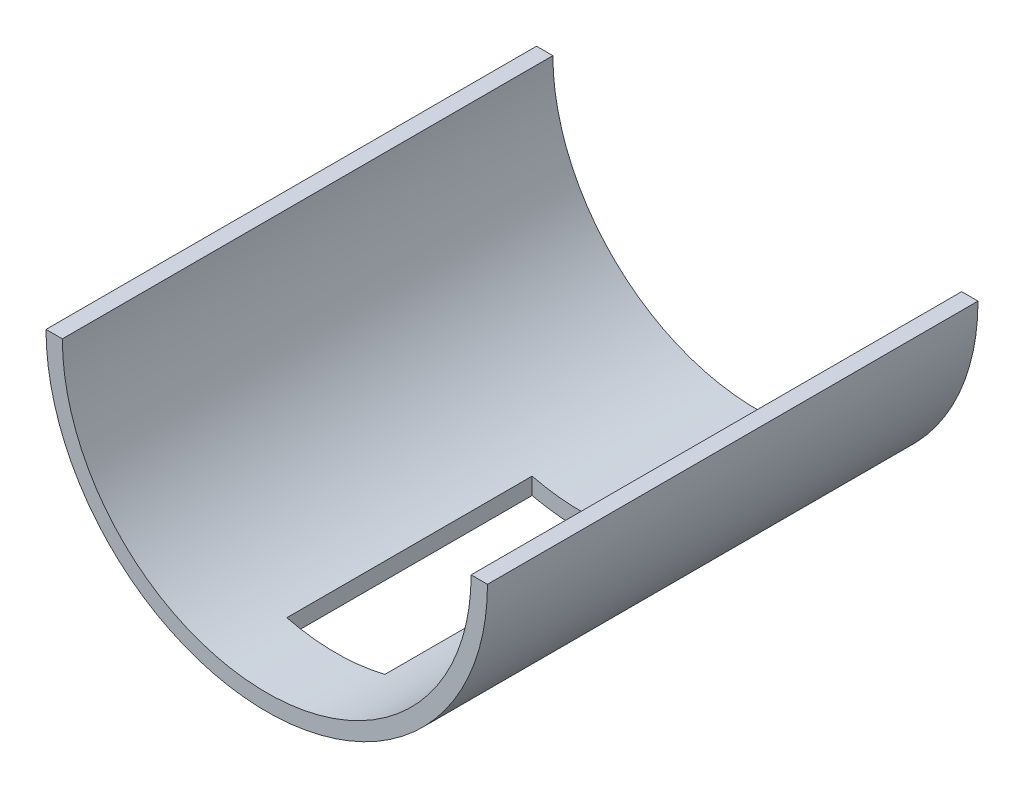
ISO-10303-21;
HEADER;
FILE_DESCRIPTION(('STEP AP214'),'2;1');
FILE_NAME('part.step','',(''),(''),'','','');
FILE_SCHEMA(('AUTOMOTIVE_DESIGN { 1 0 10303 214 1 1 1 1 }'));
ENDSEC;
DATA;
#1=APPLICATION_CONTEXT('core data for automotive mechanical design processes');
#2=APPLICATION_PROTOCOL_DEFINITION('international standard','automotive_design',2000,#1);
#3=PRODUCT_CONTEXT('',#1,'mechanical');
#4=PRODUCT('Part','Part','',(#3));
#5=PRODUCT_RELATED_PRODUCT_CATEGORY('part','',(#4));
#6=PRODUCT_DEFINITION_FORMATION('','',#4);
#7=PRODUCT_DEFINITION_CONTEXT('part definition',#1,'design');
#8=PRODUCT_DEFINITION('design','',#6,#7);
#9=PRODUCT_DEFINITION_SHAPE('','',#8);
#10=(LENGTH_UNIT() NAMED_UNIT(*) SI_UNIT(.MILLI.,.METRE.));
#11=(NAMED_UNIT(*) PLANE_ANGLE_UNIT() SI_UNIT($,.RADIAN.));
#12=(NAMED_UNIT(*) SI_UNIT($,.STERADIAN.) SOLID_ANGLE_UNIT());
#13=UNCERTAINTY_MEASURE_WITH_UNIT(LENGTH_MEASURE(1.E-05),#10,'distance_accuracy_value','');
#14=(GEOMETRIC_REPRESENTATION_CONTEXT(3) GLOBAL_UNCERTAINTY_ASSIGNED_CONTEXT((#13)) GLOBAL_UNIT_ASSIGNED_CONTEXT((#10,
#11,#12)) REPRESENTATION_CONTEXT('',''));
#15=CARTESIAN_POINT('',(0.,0.,0.));
#16=DIRECTION('',(0.,0.,1.));
#17=DIRECTION('',(1.,0.,0.));
#18=AXIS2_PLACEMENT_3D('',#15,#16,#17);
#19=CARTESIAN_POINT('',(0.,0.,60.));
#20=DIRECTION('',(0.,0.,-1.));
#21=DIRECTION('',(-1.,0.,0.));
#22=AXIS2_PLACEMENT_3D('',#19,#20,#21);
#23=CYLINDRICAL_SURFACE('',#22,27.);
#24=DIRECTION('',(0.,0.,-1.));
#25=VECTOR('',#24,1.);
#26=CARTESIAN_POINT('',(6.00000000000001,-26.3248931621764,60.));
#27=LINE('',#26,#25);
#28=CARTESIAN_POINT('',(6.00000000000001,-26.3248931621764,51.5449540452696));
#29=VERTEX_POINT('',#28);
#30=CARTESIAN_POINT('',(6.,-26.3248931621764,21.5449540452696));
#31=VERTEX_POINT('',#30);
#32=EDGE_CURVE('E106',#29,#31,#27,.T.);
#33=ORIENTED_EDGE('',*,*,#32,.T.);
#34=CARTESIAN_POINT('',(0.,0.,21.5449540452696));
#35=DIRECTION('',(0.,0.,-1.));
#36=DIRECTION('',(-1.,0.,0.));
#37=AXIS2_PLACEMENT_3D('',#34,#35,#36);
#38=CIRCLE('',#37,27.);
#39=CARTESIAN_POINT('',(-6.,-26.3248931621764,21.5449540452696));
#40=VERTEX_POINT('',#39);
#41=EDGE_CURVE('E47',#31,#40,#38,.T.);
#42=ORIENTED_EDGE('',*,*,#41,.T.);
#43=DIRECTION('',(0.,0.,-1.));
#44=VECTOR('',#43,1.);
#45=CARTESIAN_POINT('',(-5.99999999999999,-26.3248931621764,60.));
#46=LINE('',#45,#44);
#47=CARTESIAN_POINT('',(-5.99999999999999,-26.3248931621764,51.5449540452696));
#48=VERTEX_POINT('',#47);
#49=EDGE_CURVE('E99',#40,#48,#46,.F.);
#50=ORIENTED_EDGE('',*,*,#49,.T.);
#51=CARTESIAN_POINT('',(0.,0.,51.5449540452696));
#52=DIRECTION('',(0.,0.,1.));
#53=DIRECTION('',(1.,0.,0.));
#54=AXIS2_PLACEMENT_3D('',#51,#52,#53);
#55=CIRCLE('',#54,27.);
#56=EDGE_CURVE('E111',#48,#29,#55,.T.);
#57=ORIENTED_EDGE('',*,*,#56,.T.);
#58=EDGE_LOOP('',(#33,#42,#50,#57));
#59=FACE_BOUND('',#58,.T.);
#60=CARTESIAN_POINT('',(0.,0.,0.));
#61=DIRECTION('',(0.,0.,1.));
#62=DIRECTION('',(-1.,0.,0.));
#63=AXIS2_PLACEMENT_3D('',#60,#61,#62);
#64=CIRCLE('',#63,27.);
#65=CARTESIAN_POINT('',(-27.,0.,0.));
#66=VERTEX_POINT('',#65);
#67=CARTESIAN_POINT('',(27.,0.,0.));
#68=VERTEX_POINT('',#67);
#69=EDGE_CURVE('E112',#66,#68,#64,.T.);
#70=ORIENTED_EDGE('',*,*,#69,.T.);
#71=DIRECTION('',(0.,0.,-1.));
#72=VECTOR('',#71,1.);
#73=CARTESIAN_POINT('',(27.,0.,60.));
#74=LINE('',#73,#72);
#75=CARTESIAN_POINT('',(27.,0.,60.));
#76=VERTEX_POINT('',#75);
#77=EDGE_CURVE('E143',#76,#68,#74,.T.);
#78=ORIENTED_EDGE('',*,*,#77,.F.);
#79=CARTESIAN_POINT('',(0.,0.,60.));
#80=DIRECTION('',(0.,0.,1.));
#81=DIRECTION('',(-1.,0.,0.));
#82=AXIS2_PLACEMENT_3D('',#79,#80,#81);
#83=CIRCLE('',#82,27.);
#84=CARTESIAN_POINT('',(-27.,0.,60.));
#85=VERTEX_POINT('',#84);
#86=EDGE_CURVE('E120',#85,#76,#83,.T.);
#87=ORIENTED_EDGE('',*,*,#86,.F.);
#88=DIRECTION('',(0.,0.,-1.));
#89=VECTOR('',#88,1.);
#90=CARTESIAN_POINT('',(-27.,0.,60.));
#91=LINE('',#90,#89);
#92=EDGE_CURVE('E129',#85,#66,#91,.T.);
#93=ORIENTED_EDGE('',*,*,#92,.T.);
#94=EDGE_LOOP('',(#70,#78,#87,#93));
#95=FACE_BOUND('',#94,.T.);
#96=ADVANCED_FACE('F33',(#59,#95),#23,.T.);
#97=CARTESIAN_POINT('',(25.,0.,60.));
#98=DIRECTION('',(0.,-1.,0.));
#99=DIRECTION('',(0.,0.,-1.));
#100=AXIS2_PLACEMENT_3D('',#97,#98,#99);
#101=PLANE('',#100);
#102=DIRECTION('',(-1.,0.,0.));
#103=VECTOR('',#102,1.);
#104=CARTESIAN_POINT('',(25.,0.,0.));
#105=LINE('',#104,#103);
#106=CARTESIAN_POINT('',(25.,0.,0.));
#107=VERTEX_POINT('',#106);
#108=EDGE_CURVE('E115',#68,#107,#105,.T.);
#109=ORIENTED_EDGE('',*,*,#108,.T.);
#110=DIRECTION('',(0.,0.,-1.));
#111=VECTOR('',#110,1.);
#112=CARTESIAN_POINT('',(25.,0.,60.));
#113=LINE('',#112,#111);
#114=CARTESIAN_POINT('',(25.,0.,60.));
#115=VERTEX_POINT('',#114);
#116=EDGE_CURVE('E140',#115,#107,#113,.T.);
#117=ORIENTED_EDGE('',*,*,#116,.F.);
#118=DIRECTION('',(-1.,0.,0.));
#119=VECTOR('',#118,1.);
#120=CARTESIAN_POINT('',(25.,0.,60.));
#121=LINE('',#120,#119);
#122=EDGE_CURVE('E123',#76,#115,#121,.T.);
#123=ORIENTED_EDGE('',*,*,#122,.F.);
#124=ORIENTED_EDGE('',*,*,#77,.T.);
#125=EDGE_LOOP('',(#109,#117,#123,#124));
#126=FACE_BOUND('',#125,.T.);
#127=ADVANCED_FACE('F173',(#126),#101,.F.);
#128=CARTESIAN_POINT('',(0.,0.,60.));
#129=DIRECTION('',(0.,0.,-1.));
#130=DIRECTION('',(-1.,0.,0.));
#131=AXIS2_PLACEMENT_3D('',#128,#129,#130);
#132=CYLINDRICAL_SURFACE('',#131,25.);
#133=CARTESIAN_POINT('',(0.,0.,21.5449540452696));
#134=DIRECTION('',(0.,0.,-1.));
#135=DIRECTION('',(-1.,0.,0.));
#136=AXIS2_PLACEMENT_3D('',#133,#134,#135);
#137=CIRCLE('',#136,25.);
#138=CARTESIAN_POINT('',(-6.,-24.2693221990232,21.5449540452696));
#139=VERTEX_POINT('',#138);
#140=CARTESIAN_POINT('',(6.,-24.2693221990232,21.5449540452696));
#141=VERTEX_POINT('',#140);
#142=EDGE_CURVE('E146',#139,#141,#137,.F.);
#143=ORIENTED_EDGE('',*,*,#142,.T.);
#144=DIRECTION('',(0.,0.,-1.));
#145=VECTOR('',#144,1.);
#146=CARTESIAN_POINT('',(6.00000000000001,-24.2693221990232,60.));
#147=LINE('',#146,#145);
#148=CARTESIAN_POINT('',(6.00000000000001,-24.2693221990232,51.5449540452696));
#149=VERTEX_POINT('',#148);
#150=EDGE_CURVE('E11',#141,#149,#147,.F.);
#151=ORIENTED_EDGE('',*,*,#150,.T.);
#152=CARTESIAN_POINT('',(0.,0.,51.5449540452696));
#153=DIRECTION('',(0.,0.,1.));
#154=DIRECTION('',(1.,0.,0.));
#155=AXIS2_PLACEMENT_3D('',#152,#153,#154);
#156=CIRCLE('',#155,25.);
#157=CARTESIAN_POINT('',(-5.99999999999999,-24.2693221990232,51.5449540452696));
#158=VERTEX_POINT('',#157);
#159=EDGE_CURVE('E40',#149,#158,#156,.F.);
#160=ORIENTED_EDGE('',*,*,#159,.T.);
#161=DIRECTION('',(0.,0.,-1.));
#162=VECTOR('',#161,1.);
#163=CARTESIAN_POINT('',(-5.99999999999999,-24.2693221990232,60.));
#164=LINE('',#163,#162);
#165=EDGE_CURVE('E148',#158,#139,#164,.T.);
#166=ORIENTED_EDGE('',*,*,#165,.T.);
#167=EDGE_LOOP('',(#143,#151,#160,#166));
#168=FACE_BOUND('',#167,.T.);
#169=CARTESIAN_POINT('',(0.,0.,0.));
#170=DIRECTION('',(0.,0.,-1.));
#171=DIRECTION('',(-1.,0.,0.));
#172=AXIS2_PLACEMENT_3D('',#169,#170,#171);
#173=CIRCLE('',#172,25.);
#174=CARTESIAN_POINT('',(-25.,0.,0.));
#175=VERTEX_POINT('',#174);
#176=EDGE_CURVE('E132',#107,#175,#173,.T.);
#177=ORIENTED_EDGE('',*,*,#176,.T.);
#178=DIRECTION('',(0.,0.,-1.));
#179=VECTOR('',#178,1.);
#180=CARTESIAN_POINT('',(-25.,0.,60.));
#181=LINE('',#180,#179);
#182=CARTESIAN_POINT('',(-25.,0.,60.));
#183=VERTEX_POINT('',#182);
#184=EDGE_CURVE('E137',#183,#175,#181,.T.);
#185=ORIENTED_EDGE('',*,*,#184,.F.);
#186=CARTESIAN_POINT('',(0.,0.,60.));
#187=DIRECTION('',(0.,0.,-1.));
#188=DIRECTION('',(-1.,0.,0.));
#189=AXIS2_PLACEMENT_3D('',#186,#187,#188);
#190=CIRCLE('',#189,25.);
#191=EDGE_CURVE('E126',#115,#183,#190,.T.);
#192=ORIENTED_EDGE('',*,*,#191,.F.);
#193=ORIENTED_EDGE('',*,*,#116,.T.);
#194=EDGE_LOOP('',(#177,#185,#192,#193));
#195=FACE_BOUND('',#194,.T.);
#196=ADVANCED_FACE('F152',(#168,#195),#132,.F.);
#197=CARTESIAN_POINT('',(-27.,0.,60.));
#198=DIRECTION('',(0.,-1.,0.));
#199=DIRECTION('',(0.,0.,-1.));
#200=AXIS2_PLACEMENT_3D('',#197,#198,#199);
#201=PLANE('',#200);
#202=DIRECTION('',(-1.,0.,0.));
#203=VECTOR('',#202,1.);
#204=CARTESIAN_POINT('',(-27.,0.,0.));
#205=LINE('',#204,#203);
#206=EDGE_CURVE('E124',#175,#66,#205,.T.);
#207=ORIENTED_EDGE('',*,*,#206,.T.);
#208=ORIENTED_EDGE('',*,*,#92,.F.);
#209=DIRECTION('',(-1.,0.,0.));
#210=VECTOR('',#209,1.);
#211=CARTESIAN_POINT('',(-27.,0.,60.));
#212=LINE('',#211,#210);
#213=EDGE_CURVE('E128',#183,#85,#212,.T.);
#214=ORIENTED_EDGE('',*,*,#213,.F.);
#215=ORIENTED_EDGE('',*,*,#184,.T.);
#216=EDGE_LOOP('',(#207,#208,#214,#215));
#217=FACE_BOUND('',#216,.T.);
#218=ADVANCED_FACE('F181',(#217),#201,.F.);
#219=CARTESIAN_POINT('',(0.,0.,60.));
#220=DIRECTION('',(0.,0.,-1.));
#221=DIRECTION('',(-1.,0.,0.));
#222=AXIS2_PLACEMENT_3D('',#219,#220,#221);
#223=PLANE('',#222);
#224=ORIENTED_EDGE('',*,*,#86,.T.);
#225=ORIENTED_EDGE('',*,*,#122,.T.);
#226=ORIENTED_EDGE('',*,*,#191,.T.);
#227=ORIENTED_EDGE('',*,*,#213,.T.);
#228=EDGE_LOOP('',(#224,#225,#226,#227));
#229=FACE_BOUND('',#228,.T.);
#230=ADVANCED_FACE('F186',(#229),#223,.F.);
#231=CARTESIAN_POINT('',(0.,0.,0.));
#232=DIRECTION('',(0.,0.,-1.));
#233=DIRECTION('',(-1.,0.,0.));
#234=AXIS2_PLACEMENT_3D('',#231,#232,#233);
#235=PLANE('',#234);
#236=ORIENTED_EDGE('',*,*,#69,.F.);
#237=ORIENTED_EDGE('',*,*,#206,.F.);
#238=ORIENTED_EDGE('',*,*,#176,.F.);
#239=ORIENTED_EDGE('',*,*,#108,.F.);
#240=EDGE_LOOP('',(#236,#237,#238,#239));
#241=FACE_BOUND('',#240,.T.);
#242=ADVANCED_FACE('F188',(#241),#235,.T.);
#243=CARTESIAN_POINT('',(6.,-27.,21.5449540452696));
#244=DIRECTION('',(1.,0.,0.));
#245=DIRECTION('',(0.,0.,-1.));
#246=AXIS2_PLACEMENT_3D('',#243,#244,#245);
#247=PLANE('',#246);
#248=DIRECTION('',(0.,1.,0.));
#249=VECTOR('',#248,1.);
#250=CARTESIAN_POINT('',(6.00000000000001,-27.,51.5449540452696));
#251=LINE('',#250,#249);
#252=EDGE_CURVE('E100',#29,#149,#251,.T.);
#253=ORIENTED_EDGE('',*,*,#252,.T.);
#254=ORIENTED_EDGE('',*,*,#150,.F.);
#255=DIRECTION('',(0.,1.,0.));
#256=VECTOR('',#255,1.);
#257=CARTESIAN_POINT('',(6.,-27.,21.5449540452696));
#258=LINE('',#257,#256);
#259=EDGE_CURVE('E54',#31,#141,#258,.T.);
#260=ORIENTED_EDGE('',*,*,#259,.F.);
#261=ORIENTED_EDGE('',*,*,#32,.F.);
#262=EDGE_LOOP('',(#253,#254,#260,#261));
#263=FACE_BOUND('',#262,.T.);
#264=ADVANCED_FACE('F105',(#263),#247,.F.);
#265=CARTESIAN_POINT('',(-5.99999999999999,-27.,51.5449540452696));
#266=DIRECTION('',(0.,0.,1.));
#267=DIRECTION('',(1.,0.,0.));
#268=AXIS2_PLACEMENT_3D('',#265,#266,#267);
#269=PLANE('',#268);
#270=DIRECTION('',(0.,1.,0.));
#271=VECTOR('',#270,1.);
#272=CARTESIAN_POINT('',(-5.99999999999999,-27.,51.5449540452696));
#273=LINE('',#272,#271);
#274=EDGE_CURVE('E158',#48,#158,#273,.T.);
#275=ORIENTED_EDGE('',*,*,#274,.T.);
#276=ORIENTED_EDGE('',*,*,#159,.F.);
#277=ORIENTED_EDGE('',*,*,#252,.F.);
#278=ORIENTED_EDGE('',*,*,#56,.F.);
#279=EDGE_LOOP('',(#275,#276,#277,#278));
#280=FACE_BOUND('',#279,.T.);
#281=ADVANCED_FACE('F156',(#280),#269,.F.);
#282=CARTESIAN_POINT('',(-6.,-27.,21.5449540452696));
#283=DIRECTION('',(-1.,0.,0.));
#284=DIRECTION('',(0.,0.,1.));
#285=AXIS2_PLACEMENT_3D('',#282,#283,#284);
#286=PLANE('',#285);
#287=DIRECTION('',(0.,1.,0.));
#288=VECTOR('',#287,1.);
#289=CARTESIAN_POINT('',(-6.,-27.,21.5449540452696));
#290=LINE('',#289,#288);
#291=EDGE_CURVE('E97',#40,#139,#290,.T.);
#292=ORIENTED_EDGE('',*,*,#291,.T.);
#293=ORIENTED_EDGE('',*,*,#165,.F.);
#294=ORIENTED_EDGE('',*,*,#274,.F.);
#295=ORIENTED_EDGE('',*,*,#49,.F.);
#296=EDGE_LOOP('',(#292,#293,#294,#295));
#297=FACE_BOUND('',#296,.T.);
#298=ADVANCED_FACE('F163',(#297),#286,.F.);
#299=CARTESIAN_POINT('',(-6.,-27.,21.5449540452696));
#300=DIRECTION('',(0.,0.,-1.));
#301=DIRECTION('',(-1.,0.,0.));
#302=AXIS2_PLACEMENT_3D('',#299,#300,#301);
#303=PLANE('',#302);
#304=ORIENTED_EDGE('',*,*,#259,.T.);
#305=ORIENTED_EDGE('',*,*,#142,.F.);
#306=ORIENTED_EDGE('',*,*,#291,.F.);
#307=ORIENTED_EDGE('',*,*,#41,.F.);
#308=EDGE_LOOP('',(#304,#305,#306,#307));
#309=FACE_BOUND('',#308,.T.);
#310=ADVANCED_FACE('F95',(#309),#303,.F.);
#311=CLOSED_SHELL('',(#96,#127,#196,#218,#230,#242,#264,#281,#298,#310));
#312=MANIFOLD_SOLID_BREP('B2',#311);
#313=ADVANCED_BREP_SHAPE_REPRESENTATION('',(#18,#312),#14);
#314=SHAPE_DEFINITION_REPRESENTATION(#9,#313);
ENDSEC;
END-ISO-10303-21;
